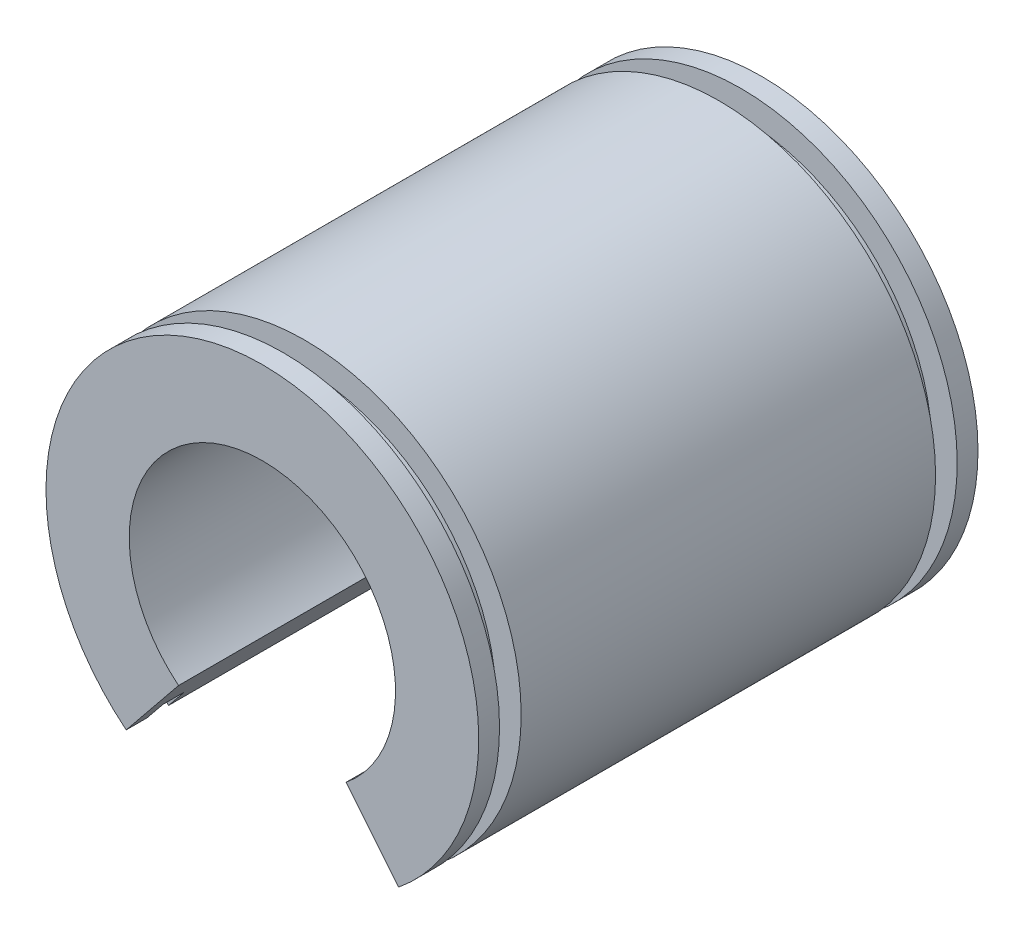
ISO-10303-21;
HEADER;
FILE_DESCRIPTION(('STEP AP214'),'2;1');
FILE_NAME('part.step','',(''),(''),'','','');
FILE_SCHEMA(('AUTOMOTIVE_DESIGN { 1 0 10303 214 1 1 1 1 }'));
ENDSEC;
DATA;
#1=APPLICATION_CONTEXT('core data for automotive mechanical design processes');
#2=APPLICATION_PROTOCOL_DEFINITION('international standard','automotive_design',2000,#1);
#3=PRODUCT_CONTEXT('',#1,'mechanical');
#4=PRODUCT('Part','Part','',(#3));
#5=PRODUCT_RELATED_PRODUCT_CATEGORY('part','',(#4));
#6=PRODUCT_DEFINITION_FORMATION('','',#4);
#7=PRODUCT_DEFINITION_CONTEXT('part definition',#1,'design');
#8=PRODUCT_DEFINITION('design','',#6,#7);
#9=PRODUCT_DEFINITION_SHAPE('','',#8);
#10=(LENGTH_UNIT() NAMED_UNIT(*) SI_UNIT(.MILLI.,.METRE.));
#11=(NAMED_UNIT(*) PLANE_ANGLE_UNIT() SI_UNIT($,.RADIAN.));
#12=(NAMED_UNIT(*) SI_UNIT($,.STERADIAN.) SOLID_ANGLE_UNIT());
#13=UNCERTAINTY_MEASURE_WITH_UNIT(LENGTH_MEASURE(1.E-05),#10,'distance_accuracy_value','');
#14=(GEOMETRIC_REPRESENTATION_CONTEXT(3) GLOBAL_UNCERTAINTY_ASSIGNED_CONTEXT((#13)) GLOBAL_UNIT_ASSIGNED_CONTEXT((#10,
#11,#12)) REPRESENTATION_CONTEXT('',''));
#15=CARTESIAN_POINT('',(0.,0.,0.));
#16=DIRECTION('',(0.,0.,1.));
#17=DIRECTION('',(1.,0.,0.));
#18=AXIS2_PLACEMENT_3D('',#15,#16,#17);
#19=CARTESIAN_POINT('',(0.,0.,-13.75));
#20=DIRECTION('',(0.,0.,1.));
#21=DIRECTION('',(1.,0.,0.));
#22=AXIS2_PLACEMENT_3D('',#19,#20,#21);
#23=PLANE('',#22);
#24=CARTESIAN_POINT('',(0.,0.,-13.75));
#25=DIRECTION('',(0.,0.,1.));
#26=DIRECTION('',(1.,0.,0.));
#27=AXIS2_PLACEMENT_3D('',#24,#25,#26);
#28=CIRCLE('',#27,11.48736354347);
#29=CARTESIAN_POINT('',(7.2292321173083,-8.92735818559566,-13.75));
#30=VERTEX_POINT('',#29);
#31=CARTESIAN_POINT('',(-7.2292321173083,-8.92735818559566,-13.75));
#32=VERTEX_POINT('',#31);
#33=EDGE_CURVE('E169',#30,#32,#28,.T.);
#34=ORIENTED_EDGE('',*,*,#33,.F.);
#35=DIRECTION('',(0.629320391050011,-0.77714596145683,0.));
#36=VECTOR('',#35,1.);
#37=CARTESIAN_POINT('',(7.229232117311,-8.927358185599,-13.75));
#38=LINE('',#37,#36);
#39=CARTESIAN_POINT('',(8.18116508364826,-10.1028974989403,-13.75));
#40=VERTEX_POINT('',#39);
#41=EDGE_CURVE('E140',#30,#40,#38,.T.);
#42=ORIENTED_EDGE('',*,*,#41,.T.);
#43=CARTESIAN_POINT('',(0.,0.,-13.75));
#44=DIRECTION('',(0.,0.,1.));
#45=DIRECTION('',(1.,0.,0.));
#46=AXIS2_PLACEMENT_3D('',#43,#44,#45);
#47=CIRCLE('',#46,13.);
#48=CARTESIAN_POINT('',(-8.18116508364826,-10.1028974989403,-13.75));
#49=VERTEX_POINT('',#48);
#50=EDGE_CURVE('E136',#49,#40,#47,.F.);
#51=ORIENTED_EDGE('',*,*,#50,.F.);
#52=DIRECTION('',(0.629320391050011,0.77714596145683,0.));
#53=VECTOR('',#52,1.);
#54=CARTESIAN_POINT('',(-8.181165083648,-10.10289749894,-13.75));
#55=LINE('',#54,#53);
#56=EDGE_CURVE('E142',#49,#32,#55,.T.);
#57=ORIENTED_EDGE('',*,*,#56,.T.);
#58=EDGE_LOOP('',(#34,#42,#51,#57));
#59=FACE_BOUND('',#58,.T.);
#60=ADVANCED_FACE('F17',(#59),#23,.T.);
#61=CARTESIAN_POINT('',(0.,0.,13.75));
#62=DIRECTION('',(0.,0.,1.));
#63=DIRECTION('',(1.,0.,0.));
#64=AXIS2_PLACEMENT_3D('',#61,#62,#63);
#65=PLANE('',#64);
#66=DIRECTION('',(0.629320391050011,0.77714596145683,0.));
#67=VECTOR('',#66,1.);
#68=CARTESIAN_POINT('',(-8.181165083648,-10.10289749894,13.75));
#69=LINE('',#68,#67);
#70=CARTESIAN_POINT('',(-8.18116508364826,-10.1028974989403,13.75));
#71=VERTEX_POINT('',#70);
#72=CARTESIAN_POINT('',(-7.22923211730981,-8.9273581855972,13.75));
#73=VERTEX_POINT('',#72);
#74=EDGE_CURVE('E108',#71,#73,#69,.T.);
#75=ORIENTED_EDGE('',*,*,#74,.F.);
#76=CARTESIAN_POINT('',(0.,0.,13.75));
#77=DIRECTION('',(0.,0.,1.));
#78=DIRECTION('',(1.,0.,0.));
#79=AXIS2_PLACEMENT_3D('',#76,#77,#78);
#80=CIRCLE('',#79,13.);
#81=CARTESIAN_POINT('',(8.18116508364826,-10.1028974989403,13.75));
#82=VERTEX_POINT('',#81);
#83=EDGE_CURVE('E20',#82,#71,#80,.T.);
#84=ORIENTED_EDGE('',*,*,#83,.F.);
#85=DIRECTION('',(0.629320391050011,-0.77714596145683,0.));
#86=VECTOR('',#85,1.);
#87=CARTESIAN_POINT('',(7.229232117311,-8.927358185599,13.75));
#88=LINE('',#87,#86);
#89=CARTESIAN_POINT('',(7.2292321173083,-8.92735818559566,13.75));
#90=VERTEX_POINT('',#89);
#91=EDGE_CURVE('E103',#90,#82,#88,.T.);
#92=ORIENTED_EDGE('',*,*,#91,.F.);
#93=CARTESIAN_POINT('',(0.,0.,13.75));
#94=DIRECTION('',(0.,0.,1.));
#95=DIRECTION('',(1.,0.,0.));
#96=AXIS2_PLACEMENT_3D('',#93,#94,#95);
#97=CIRCLE('',#96,11.48736354347);
#98=EDGE_CURVE('E114',#73,#90,#97,.F.);
#99=ORIENTED_EDGE('',*,*,#98,.F.);
#100=EDGE_LOOP('',(#75,#84,#92,#99));
#101=FACE_BOUND('',#100,.T.);
#102=ADVANCED_FACE('F110',(#101),#65,.F.);
#103=CARTESIAN_POINT('',(0.,0.,-15.));
#104=DIRECTION('',(0.,0.,1.));
#105=DIRECTION('',(1.,0.,0.));
#106=AXIS2_PLACEMENT_3D('',#103,#104,#105);
#107=CYLINDRICAL_SURFACE('',#106,13.);
#108=CARTESIAN_POINT('',(0.,0.,15.));
#109=DIRECTION('',(0.,0.,1.));
#110=DIRECTION('',(1.,0.,0.));
#111=AXIS2_PLACEMENT_3D('',#108,#109,#110);
#112=CIRCLE('',#111,13.);
#113=CARTESIAN_POINT('',(8.18116508364801,-10.1028974989405,15.));
#114=VERTEX_POINT('',#113);
#115=CARTESIAN_POINT('',(-8.18116508364826,-10.1028974989403,15.));
#116=VERTEX_POINT('',#115);
#117=EDGE_CURVE('E130',#114,#116,#112,.T.);
#118=ORIENTED_EDGE('',*,*,#117,.F.);
#119=DIRECTION('',(0.,0.,1.));
#120=VECTOR('',#119,1.);
#121=CARTESIAN_POINT('',(8.18116508364826,-10.1028974989403,-15.));
#122=LINE('',#121,#120);
#123=EDGE_CURVE('E127',#114,#82,#122,.F.);
#124=ORIENTED_EDGE('',*,*,#123,.T.);
#125=ORIENTED_EDGE('',*,*,#83,.T.);
#126=DIRECTION('',(0.,0.,1.));
#127=VECTOR('',#126,1.);
#128=CARTESIAN_POINT('',(-8.18116508364826,-10.1028974989403,-15.));
#129=LINE('',#128,#127);
#130=EDGE_CURVE('E119',#71,#116,#129,.T.);
#131=ORIENTED_EDGE('',*,*,#130,.T.);
#132=EDGE_LOOP('',(#118,#124,#125,#131));
#133=FACE_BOUND('',#132,.T.);
#134=ADVANCED_FACE('F129',(#133),#107,.T.);
#135=CARTESIAN_POINT('',(0.,0.,-15.));
#136=DIRECTION('',(0.,0.,1.));
#137=DIRECTION('',(1.,0.,0.));
#138=AXIS2_PLACEMENT_3D('',#135,#136,#137);
#139=CYLINDRICAL_SURFACE('',#138,13.);
#140=ORIENTED_EDGE('',*,*,#50,.T.);
#141=DIRECTION('',(0.,0.,1.));
#142=VECTOR('',#141,1.);
#143=CARTESIAN_POINT('',(8.18116508364826,-10.1028974989403,-15.));
#144=LINE('',#143,#142);
#145=CARTESIAN_POINT('',(8.18116508364801,-10.1028974989405,-15.));
#146=VERTEX_POINT('',#145);
#147=EDGE_CURVE('E173',#40,#146,#144,.F.);
#148=ORIENTED_EDGE('',*,*,#147,.T.);
#149=CARTESIAN_POINT('',(0.,0.,-15.));
#150=DIRECTION('',(0.,0.,1.));
#151=DIRECTION('',(1.,0.,0.));
#152=AXIS2_PLACEMENT_3D('',#149,#150,#151);
#153=CIRCLE('',#152,13.);
#154=CARTESIAN_POINT('',(-8.18116508364826,-10.1028974989403,-15.));
#155=VERTEX_POINT('',#154);
#156=EDGE_CURVE('E159',#146,#155,#153,.T.);
#157=ORIENTED_EDGE('',*,*,#156,.T.);
#158=DIRECTION('',(0.,0.,1.));
#159=VECTOR('',#158,1.);
#160=CARTESIAN_POINT('',(-8.18116508364826,-10.1028974989403,-15.));
#161=LINE('',#160,#159);
#162=EDGE_CURVE('E133',#155,#49,#161,.T.);
#163=ORIENTED_EDGE('',*,*,#162,.T.);
#164=EDGE_LOOP('',(#140,#148,#157,#163));
#165=FACE_BOUND('',#164,.T.);
#166=ADVANCED_FACE('F231',(#165),#139,.T.);
#167=CARTESIAN_POINT('',(0.,0.,-60.94167217877));
#168=DIRECTION('',(0.,0.,1.));
#169=DIRECTION('',(1.,0.,0.));
#170=AXIS2_PLACEMENT_3D('',#167,#168,#169);
#171=CYLINDRICAL_SURFACE('',#170,11.48736354347);
#172=DIRECTION('',(0.,0.,1.));
#173=VECTOR('',#172,1.);
#174=CARTESIAN_POINT('',(7.2292321173083,-8.92735818559566,-60.94167217877));
#175=LINE('',#174,#173);
#176=CARTESIAN_POINT('',(7.22923211730821,-8.92735818559573,-12.45));
#177=VERTEX_POINT('',#176);
#178=EDGE_CURVE('E171',#177,#30,#175,.F.);
#179=ORIENTED_EDGE('',*,*,#178,.T.);
#180=ORIENTED_EDGE('',*,*,#33,.T.);
#181=DIRECTION('',(0.,0.,1.));
#182=VECTOR('',#181,1.);
#183=CARTESIAN_POINT('',(-7.2292321173083,-8.92735818559566,-60.94167217877));
#184=LINE('',#183,#182);
#185=CARTESIAN_POINT('',(-7.22923211730846,-8.92735818559553,-12.45));
#186=VERTEX_POINT('',#185);
#187=EDGE_CURVE('E176',#32,#186,#184,.T.);
#188=ORIENTED_EDGE('',*,*,#187,.T.);
#189=CARTESIAN_POINT('',(0.,0.,-12.45));
#190=DIRECTION('',(0.,0.,1.));
#191=DIRECTION('',(1.,0.,0.));
#192=AXIS2_PLACEMENT_3D('',#189,#190,#191);
#193=CIRCLE('',#192,11.48736354347);
#194=EDGE_CURVE('E155',#186,#177,#193,.F.);
#195=ORIENTED_EDGE('',*,*,#194,.T.);
#196=EDGE_LOOP('',(#179,#180,#188,#195));
#197=FACE_BOUND('',#196,.T.);
#198=ADVANCED_FACE('F224',(#197),#171,.T.);
#199=CARTESIAN_POINT('',(0.,0.,-60.94167217877));
#200=DIRECTION('',(0.,0.,1.));
#201=DIRECTION('',(1.,0.,0.));
#202=AXIS2_PLACEMENT_3D('',#199,#200,#201);
#203=CYLINDRICAL_SURFACE('',#202,11.48736354347);
#204=DIRECTION('',(0.,0.,1.));
#205=VECTOR('',#204,1.);
#206=CARTESIAN_POINT('',(7.2292321173083,-8.92735818559566,-60.94167217877));
#207=LINE('',#206,#205);
#208=CARTESIAN_POINT('',(7.22923211730821,-8.92735818559573,12.45));
#209=VERTEX_POINT('',#208);
#210=EDGE_CURVE('E167',#90,#209,#207,.F.);
#211=ORIENTED_EDGE('',*,*,#210,.T.);
#212=CARTESIAN_POINT('',(0.,0.,12.45));
#213=DIRECTION('',(0.,0.,1.));
#214=DIRECTION('',(1.,0.,0.));
#215=AXIS2_PLACEMENT_3D('',#212,#213,#214);
#216=CIRCLE('',#215,11.48736354347);
#217=CARTESIAN_POINT('',(-7.22923211730981,-8.9273581855972,12.45));
#218=VERTEX_POINT('',#217);
#219=EDGE_CURVE('E151',#218,#209,#216,.F.);
#220=ORIENTED_EDGE('',*,*,#219,.F.);
#221=DIRECTION('',(0.,0.,1.));
#222=VECTOR('',#221,1.);
#223=CARTESIAN_POINT('',(-7.22923211731132,-8.92735818559874,-15.));
#224=LINE('',#223,#222);
#225=EDGE_CURVE('E158',#73,#218,#224,.F.);
#226=ORIENTED_EDGE('',*,*,#225,.F.);
#227=ORIENTED_EDGE('',*,*,#98,.T.);
#228=EDGE_LOOP('',(#211,#220,#226,#227));
#229=FACE_BOUND('',#228,.T.);
#230=ADVANCED_FACE('F213',(#229),#203,.T.);
#231=CARTESIAN_POINT('',(0.,0.,15.));
#232=DIRECTION('',(0.,0.,1.));
#233=DIRECTION('',(1.,0.,0.));
#234=AXIS2_PLACEMENT_3D('',#231,#232,#233);
#235=PLANE('',#234);
#236=DIRECTION('',(0.629320391049801,0.777145961457001,0.));
#237=VECTOR('',#236,1.);
#238=CARTESIAN_POINT('',(-8.181165083648,-10.10289749894,15.));
#239=LINE('',#238,#237);
#240=CARTESIAN_POINT('',(-5.03456312839937,-6.21716769165546,15.));
#241=VERTEX_POINT('',#240);
#242=EDGE_CURVE('E123',#241,#116,#239,.F.);
#243=ORIENTED_EDGE('',*,*,#242,.F.);
#244=CARTESIAN_POINT('',(0.,0.,15.));
#245=DIRECTION('',(0.,0.,1.));
#246=DIRECTION('',(1.,0.,0.));
#247=AXIS2_PLACEMENT_3D('',#244,#245,#246);
#248=CIRCLE('',#247,8.);
#249=CARTESIAN_POINT('',(5.03456312839888,-6.21716769165586,15.));
#250=VERTEX_POINT('',#249);
#251=EDGE_CURVE('E164',#241,#250,#248,.F.);
#252=ORIENTED_EDGE('',*,*,#251,.T.);
#253=DIRECTION('',(0.629320391049801,-0.777145961457001,0.));
#254=VECTOR('',#253,1.);
#255=CARTESIAN_POINT('',(5.034563128399,-6.217167691656,15.));
#256=LINE('',#255,#254);
#257=EDGE_CURVE('E153',#114,#250,#256,.F.);
#258=ORIENTED_EDGE('',*,*,#257,.F.);
#259=ORIENTED_EDGE('',*,*,#117,.T.);
#260=EDGE_LOOP('',(#243,#252,#258,#259));
#261=FACE_BOUND('',#260,.T.);
#262=ADVANCED_FACE('F235',(#261),#235,.T.);
#263=CARTESIAN_POINT('',(0.,0.,-15.));
#264=DIRECTION('',(0.,0.,1.));
#265=DIRECTION('',(1.,0.,0.));
#266=AXIS2_PLACEMENT_3D('',#263,#264,#265);
#267=CYLINDRICAL_SURFACE('',#266,8.);
#268=ORIENTED_EDGE('',*,*,#251,.F.);
#269=DIRECTION('',(0.,0.,1.));
#270=VECTOR('',#269,1.);
#271=CARTESIAN_POINT('',(-5.03456312839949,-6.2171676916556,-15.));
#272=LINE('',#271,#270);
#273=CARTESIAN_POINT('',(-5.03456312839937,-6.21716769165546,-15.));
#274=VERTEX_POINT('',#273);
#275=EDGE_CURVE('E187',#274,#241,#272,.T.);
#276=ORIENTED_EDGE('',*,*,#275,.F.);
#277=CARTESIAN_POINT('',(0.,0.,-15.));
#278=DIRECTION('',(0.,0.,1.));
#279=DIRECTION('',(1.,0.,0.));
#280=AXIS2_PLACEMENT_3D('',#277,#278,#279);
#281=CIRCLE('',#280,8.);
#282=CARTESIAN_POINT('',(5.03456312839888,-6.21716769165586,-15.));
#283=VERTEX_POINT('',#282);
#284=EDGE_CURVE('E162',#274,#283,#281,.F.);
#285=ORIENTED_EDGE('',*,*,#284,.T.);
#286=DIRECTION('',(0.,0.,1.));
#287=VECTOR('',#286,1.);
#288=CARTESIAN_POINT('',(5.034563128399,-6.217167691656,-15.));
#289=LINE('',#288,#287);
#290=EDGE_CURVE('E194',#250,#283,#289,.F.);
#291=ORIENTED_EDGE('',*,*,#290,.F.);
#292=EDGE_LOOP('',(#268,#276,#285,#291));
#293=FACE_BOUND('',#292,.T.);
#294=ADVANCED_FACE('F233',(#293),#267,.F.);
#295=CARTESIAN_POINT('',(0.,0.,-15.));
#296=DIRECTION('',(0.,0.,1.));
#297=DIRECTION('',(1.,0.,0.));
#298=AXIS2_PLACEMENT_3D('',#295,#296,#297);
#299=PLANE('',#298);
#300=ORIENTED_EDGE('',*,*,#156,.F.);
#301=DIRECTION('',(0.629320391049801,-0.777145961457001,0.));
#302=VECTOR('',#301,1.);
#303=CARTESIAN_POINT('',(5.034563128399,-6.217167691656,-15.));
#304=LINE('',#303,#302);
#305=EDGE_CURVE('E195',#283,#146,#304,.T.);
#306=ORIENTED_EDGE('',*,*,#305,.F.);
#307=ORIENTED_EDGE('',*,*,#284,.F.);
#308=DIRECTION('',(0.629320391049801,0.777145961457001,0.));
#309=VECTOR('',#308,1.);
#310=CARTESIAN_POINT('',(-8.181165083648,-10.10289749894,-15.));
#311=LINE('',#310,#309);
#312=EDGE_CURVE('E184',#155,#274,#311,.T.);
#313=ORIENTED_EDGE('',*,*,#312,.F.);
#314=EDGE_LOOP('',(#300,#306,#307,#313));
#315=FACE_BOUND('',#314,.T.);
#316=ADVANCED_FACE('F228',(#315),#299,.F.);
#317=CARTESIAN_POINT('',(0.,0.,-12.45));
#318=DIRECTION('',(0.,0.,1.));
#319=DIRECTION('',(1.,0.,0.));
#320=AXIS2_PLACEMENT_3D('',#317,#318,#319);
#321=PLANE('',#320);
#322=DIRECTION('',(0.629320391049801,0.777145961457001,0.));
#323=VECTOR('',#322,1.);
#324=CARTESIAN_POINT('',(-8.181165083648,-10.10289749894,-12.45));
#325=LINE('',#324,#323);
#326=CARTESIAN_POINT('',(-8.18116508364826,-10.1028974989403,-12.45));
#327=VERTEX_POINT('',#326);
#328=EDGE_CURVE('E188',#327,#186,#325,.T.);
#329=ORIENTED_EDGE('',*,*,#328,.F.);
#330=CARTESIAN_POINT('',(0.,0.,-12.45));
#331=DIRECTION('',(0.,0.,1.));
#332=DIRECTION('',(1.,0.,0.));
#333=AXIS2_PLACEMENT_3D('',#330,#331,#332);
#334=CIRCLE('',#333,13.);
#335=CARTESIAN_POINT('',(8.18116508364801,-10.1028974989405,-12.45));
#336=VERTEX_POINT('',#335);
#337=EDGE_CURVE('E148',#336,#327,#334,.T.);
#338=ORIENTED_EDGE('',*,*,#337,.F.);
#339=DIRECTION('',(0.629320391049801,-0.777145961457001,0.));
#340=VECTOR('',#339,1.);
#341=CARTESIAN_POINT('',(5.034563128399,-6.217167691656,-12.45));
#342=LINE('',#341,#340);
#343=EDGE_CURVE('E198',#177,#336,#342,.T.);
#344=ORIENTED_EDGE('',*,*,#343,.F.);
#345=ORIENTED_EDGE('',*,*,#194,.F.);
#346=EDGE_LOOP('',(#329,#338,#344,#345));
#347=FACE_BOUND('',#346,.T.);
#348=ADVANCED_FACE('F219',(#347),#321,.F.);
#349=CARTESIAN_POINT('',(-8.181165083648,-10.10289749894,-15.));
#350=DIRECTION('',(0.777145961457001,-0.629320391049801,0.));
#351=DIRECTION('',(0.629320391049801,0.777145961457001,0.));
#352=AXIS2_PLACEMENT_3D('',#349,#350,#351);
#353=PLANE('',#352);
#354=ORIENTED_EDGE('',*,*,#130,.F.);
#355=ORIENTED_EDGE('',*,*,#74,.T.);
#356=ORIENTED_EDGE('',*,*,#225,.T.);
#357=DIRECTION('',(0.629320391050011,0.77714596145683,0.));
#358=VECTOR('',#357,1.);
#359=CARTESIAN_POINT('',(-8.181165083648,-10.10289749894,12.45));
#360=LINE('',#359,#358);
#361=CARTESIAN_POINT('',(-8.18116508364826,-10.1028974989403,12.45));
#362=VERTEX_POINT('',#361);
#363=EDGE_CURVE('E154',#362,#218,#360,.T.);
#364=ORIENTED_EDGE('',*,*,#363,.F.);
#365=DIRECTION('',(0.,0.,1.));
#366=VECTOR('',#365,1.);
#367=CARTESIAN_POINT('',(-8.18116508364826,-10.1028974989403,-15.));
#368=LINE('',#367,#366);
#369=EDGE_CURVE('E147',#327,#362,#368,.T.);
#370=ORIENTED_EDGE('',*,*,#369,.F.);
#371=ORIENTED_EDGE('',*,*,#328,.T.);
#372=ORIENTED_EDGE('',*,*,#187,.F.);
#373=ORIENTED_EDGE('',*,*,#56,.F.);
#374=ORIENTED_EDGE('',*,*,#162,.F.);
#375=ORIENTED_EDGE('',*,*,#312,.T.);
#376=ORIENTED_EDGE('',*,*,#275,.T.);
#377=ORIENTED_EDGE('',*,*,#242,.T.);
#378=EDGE_LOOP('',(#354,#355,#356,#364,#370,#371,#372,#373,#374,#375,#376,#377));
#379=FACE_BOUND('',#378,.T.);
#380=ADVANCED_FACE('F120',(#379),#353,.T.);
#381=CARTESIAN_POINT('',(0.,0.,12.45));
#382=DIRECTION('',(0.,0.,1.));
#383=DIRECTION('',(1.,0.,0.));
#384=AXIS2_PLACEMENT_3D('',#381,#382,#383);
#385=PLANE('',#384);
#386=ORIENTED_EDGE('',*,*,#219,.T.);
#387=DIRECTION('',(0.629320391049801,-0.777145961457001,0.));
#388=VECTOR('',#387,1.);
#389=CARTESIAN_POINT('',(5.034563128399,-6.217167691656,12.45));
#390=LINE('',#389,#388);
#391=CARTESIAN_POINT('',(8.18116508364801,-10.1028974989405,12.45));
#392=VERTEX_POINT('',#391);
#393=EDGE_CURVE('E35',#392,#209,#390,.F.);
#394=ORIENTED_EDGE('',*,*,#393,.F.);
#395=CARTESIAN_POINT('',(0.,0.,12.45));
#396=DIRECTION('',(0.,0.,1.));
#397=DIRECTION('',(1.,0.,0.));
#398=AXIS2_PLACEMENT_3D('',#395,#396,#397);
#399=CIRCLE('',#398,13.);
#400=EDGE_CURVE('E26',#362,#392,#399,.F.);
#401=ORIENTED_EDGE('',*,*,#400,.F.);
#402=ORIENTED_EDGE('',*,*,#363,.T.);
#403=EDGE_LOOP('',(#386,#394,#401,#402));
#404=FACE_BOUND('',#403,.T.);
#405=ADVANCED_FACE('F209',(#404),#385,.T.);
#406=CARTESIAN_POINT('',(5.034563128399,-6.217167691656,-15.));
#407=DIRECTION('',(-0.777145961457001,-0.629320391049801,0.));
#408=DIRECTION('',(0.629320391049801,-0.777145961457001,0.));
#409=AXIS2_PLACEMENT_3D('',#406,#407,#408);
#410=PLANE('',#409);
#411=ORIENTED_EDGE('',*,*,#210,.F.);
#412=ORIENTED_EDGE('',*,*,#91,.T.);
#413=ORIENTED_EDGE('',*,*,#123,.F.);
#414=ORIENTED_EDGE('',*,*,#257,.T.);
#415=ORIENTED_EDGE('',*,*,#290,.T.);
#416=ORIENTED_EDGE('',*,*,#305,.T.);
#417=ORIENTED_EDGE('',*,*,#147,.F.);
#418=ORIENTED_EDGE('',*,*,#41,.F.);
#419=ORIENTED_EDGE('',*,*,#178,.F.);
#420=ORIENTED_EDGE('',*,*,#343,.T.);
#421=DIRECTION('',(0.,0.,1.));
#422=VECTOR('',#421,1.);
#423=CARTESIAN_POINT('',(8.18116508364826,-10.1028974989403,-15.));
#424=LINE('',#423,#422);
#425=EDGE_CURVE('E11',#392,#336,#424,.F.);
#426=ORIENTED_EDGE('',*,*,#425,.F.);
#427=ORIENTED_EDGE('',*,*,#393,.T.);
#428=EDGE_LOOP('',(#411,#412,#413,#414,#415,#416,#417,#418,#419,#420,#426,#427));
#429=FACE_BOUND('',#428,.T.);
#430=ADVANCED_FACE('F214',(#429),#410,.T.);
#431=CARTESIAN_POINT('',(0.,0.,-15.));
#432=DIRECTION('',(0.,0.,1.));
#433=DIRECTION('',(1.,0.,0.));
#434=AXIS2_PLACEMENT_3D('',#431,#432,#433);
#435=CYLINDRICAL_SURFACE('',#434,13.);
#436=ORIENTED_EDGE('',*,*,#400,.T.);
#437=ORIENTED_EDGE('',*,*,#425,.T.);
#438=ORIENTED_EDGE('',*,*,#337,.T.);
#439=ORIENTED_EDGE('',*,*,#369,.T.);
#440=EDGE_LOOP('',(#436,#437,#438,#439));
#441=FACE_BOUND('',#440,.T.);
#442=ADVANCED_FACE('F217',(#441),#435,.T.);
#443=CLOSED_SHELL('',(#60,#102,#134,#166,#198,#230,#262,#294,#316,#348,#380,#405,#430,#442));
#444=MANIFOLD_SOLID_BREP('B1',#443);
#445=ADVANCED_BREP_SHAPE_REPRESENTATION('',(#18,#444),#14);
#446=SHAPE_DEFINITION_REPRESENTATION(#9,#445);
ENDSEC;
END-ISO-10303-21;
